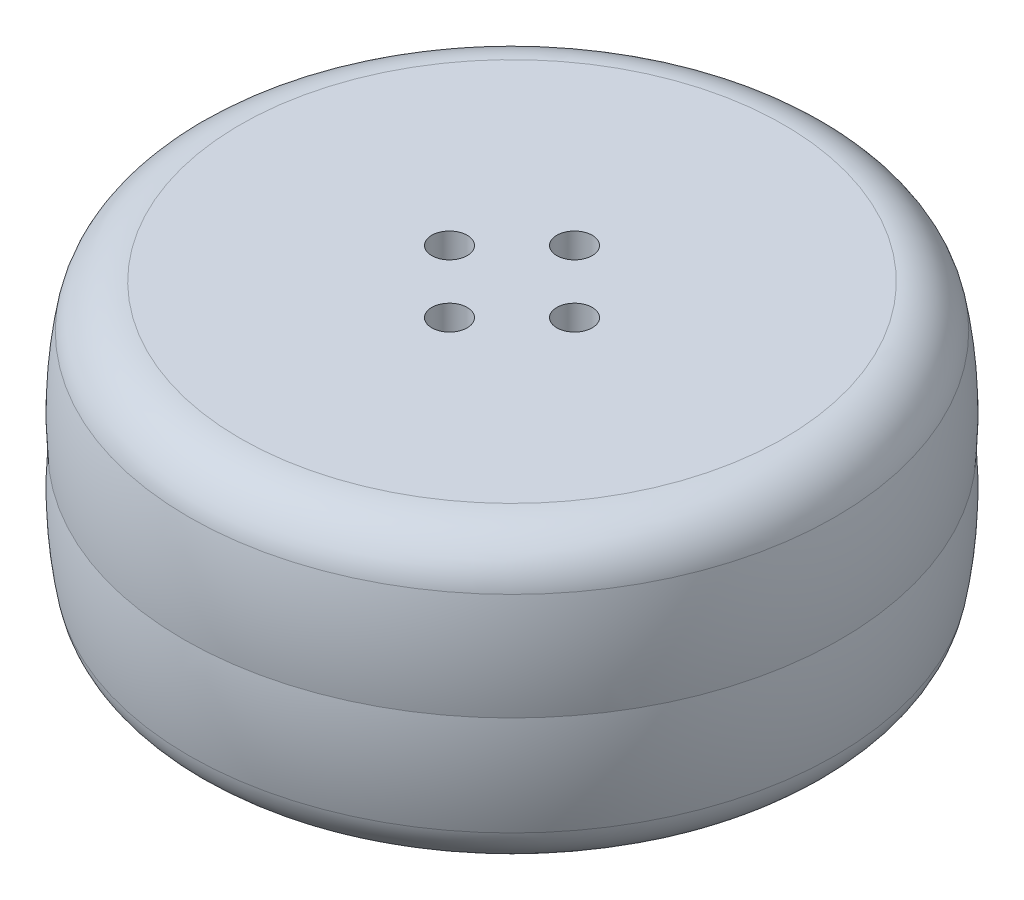
ISO-10303-21;
HEADER;
FILE_DESCRIPTION(('STEP AP214'),'2;1');
FILE_NAME('part.step','',(''),(''),'','','');
FILE_SCHEMA(('AUTOMOTIVE_DESIGN { 1 0 10303 214 1 1 1 1 }'));
ENDSEC;
DATA;
#1=APPLICATION_CONTEXT('core data for automotive mechanical design processes');
#2=APPLICATION_PROTOCOL_DEFINITION('international standard','automotive_design',2000,#1);
#3=PRODUCT_CONTEXT('',#1,'mechanical');
#4=PRODUCT('Part','Part','',(#3));
#5=PRODUCT_RELATED_PRODUCT_CATEGORY('part','',(#4));
#6=PRODUCT_DEFINITION_FORMATION('','',#4);
#7=PRODUCT_DEFINITION_CONTEXT('part definition',#1,'design');
#8=PRODUCT_DEFINITION('design','',#6,#7);
#9=PRODUCT_DEFINITION_SHAPE('','',#8);
#10=(LENGTH_UNIT() NAMED_UNIT(*) SI_UNIT(.MILLI.,.METRE.));
#11=(NAMED_UNIT(*) PLANE_ANGLE_UNIT() SI_UNIT($,.RADIAN.));
#12=(NAMED_UNIT(*) SI_UNIT($,.STERADIAN.) SOLID_ANGLE_UNIT());
#13=UNCERTAINTY_MEASURE_WITH_UNIT(LENGTH_MEASURE(1.E-05),#10,'distance_accuracy_value','');
#14=(GEOMETRIC_REPRESENTATION_CONTEXT(3) GLOBAL_UNCERTAINTY_ASSIGNED_CONTEXT((#13)) GLOBAL_UNIT_ASSIGNED_CONTEXT((#10,
#11,#12)) REPRESENTATION_CONTEXT('',''));
#15=CARTESIAN_POINT('',(0.,0.,0.));
#16=DIRECTION('',(0.,0.,1.));
#17=DIRECTION('',(1.,0.,0.));
#18=AXIS2_PLACEMENT_3D('',#15,#16,#17);
#19=CARTESIAN_POINT('',(0.,-17.9587381258583,0.));
#20=DIRECTION('',(0.,-1.,0.));
#21=DIRECTION('',(0.,0.,-1.));
#22=AXIS2_PLACEMENT_3D('',#19,#20,#21);
#23=PLANE('',#22);
#24=CARTESIAN_POINT('',(0.,-17.9587381258583,-6.));
#25=DIRECTION('',(0.,1.,0.));
#26=DIRECTION('',(0.,0.,1.));
#27=AXIS2_PLACEMENT_3D('',#24,#25,#26);
#28=CIRCLE('',#27,1.7);
#29=CARTESIAN_POINT('',(0.,-17.9587381258583,-4.3));
#30=VERTEX_POINT('',#29);
#31=EDGE_CURVE('E76',#30,#30,#28,.T.);
#32=ORIENTED_EDGE('',*,*,#31,.F.);
#33=EDGE_LOOP('',(#32));
#34=FACE_BOUND('',#33,.T.);
#35=CARTESIAN_POINT('',(6.,-17.9587381258583,0.));
#36=DIRECTION('',(0.,1.,0.));
#37=DIRECTION('',(0.,0.,1.));
#38=AXIS2_PLACEMENT_3D('',#35,#36,#37);
#39=CIRCLE('',#38,1.7);
#40=CARTESIAN_POINT('',(6.,-17.9587381258583,1.70000000000004));
#41=VERTEX_POINT('',#40);
#42=EDGE_CURVE('E80',#41,#41,#39,.T.);
#43=ORIENTED_EDGE('',*,*,#42,.F.);
#44=EDGE_LOOP('',(#43));
#45=FACE_BOUND('',#44,.T.);
#46=CARTESIAN_POINT('',(0.,-17.9587381258583,6.));
#47=DIRECTION('',(0.,1.,0.));
#48=DIRECTION('',(0.,0.,1.));
#49=AXIS2_PLACEMENT_3D('',#46,#47,#48);
#50=CIRCLE('',#49,1.7);
#51=CARTESIAN_POINT('',(0.,-17.9587381258583,7.7));
#52=VERTEX_POINT('',#51);
#53=EDGE_CURVE('E84',#52,#52,#50,.T.);
#54=ORIENTED_EDGE('',*,*,#53,.F.);
#55=EDGE_LOOP('',(#54));
#56=FACE_BOUND('',#55,.T.);
#57=CARTESIAN_POINT('',(-6.,-17.9587381258583,0.));
#58=DIRECTION('',(0.,1.,0.));
#59=DIRECTION('',(0.,0.,1.));
#60=AXIS2_PLACEMENT_3D('',#57,#58,#59);
#61=CIRCLE('',#60,1.7);
#62=CARTESIAN_POINT('',(-6.,-17.9587381258583,1.7));
#63=VERTEX_POINT('',#62);
#64=EDGE_CURVE('E87',#63,#63,#61,.T.);
#65=ORIENTED_EDGE('',*,*,#64,.F.);
#66=EDGE_LOOP('',(#65));
#67=FACE_BOUND('',#66,.T.);
#68=CARTESIAN_POINT('',(0.,-17.9587381258583,0.));
#69=DIRECTION('',(0.,1.,0.));
#70=DIRECTION('',(0.,0.,1.));
#71=AXIS2_PLACEMENT_3D('',#68,#69,#70);
#72=CIRCLE('',#71,26.0781368785709);
#73=CARTESIAN_POINT('',(0.,-17.9587381258583,26.0781368785709));
#74=VERTEX_POINT('',#73);
#75=EDGE_CURVE('E10',#74,#74,#72,.T.);
#76=ORIENTED_EDGE('',*,*,#75,.T.);
#77=EDGE_LOOP('',(#76));
#78=FACE_BOUND('',#77,.T.);
#79=ADVANCED_FACE('F31',(#34,#45,#56,#67,#78),#23,.F.);
#80=CARTESIAN_POINT('',(0.,-22.9587381258583,0.));
#81=DIRECTION('',(0.,1.,0.));
#82=DIRECTION('',(0.,0.,1.));
#83=AXIS2_PLACEMENT_3D('',#80,#81,#82);
#84=TOROIDAL_SURFACE('',#83,26.0781368785709,5.);
#85=ORIENTED_EDGE('',*,*,#75,.F.);
#86=EDGE_LOOP('',(#85));
#87=FACE_BOUND('',#86,.T.);
#88=CARTESIAN_POINT('',(0.,-22.0459118257492,0.));
#89=DIRECTION('',(0.,1.,0.));
#90=DIRECTION('',(0.,0.,1.));
#91=AXIS2_PLACEMENT_3D('',#88,#89,#90);
#92=CIRCLE('',#91,30.9941055670217);
#93=CARTESIAN_POINT('',(0.,-22.0459118257492,30.9941055670217));
#94=VERTEX_POINT('',#93);
#95=EDGE_CURVE('E37',#94,#94,#92,.T.);
#96=ORIENTED_EDGE('',*,*,#95,.T.);
#97=EDGE_LOOP('',(#96));
#98=FACE_BOUND('',#97,.T.);
#99=ADVANCED_FACE('F60',(#87,#98),#84,.T.);
#100=CARTESIAN_POINT('',(0.,-31.9587381258583,-31.5));
#101=CARTESIAN_POINT('',(0.,-28.6447966830478,-31.7712144320331));
#102=CARTESIAN_POINT('',(0.,-25.308943196372,-31.6000046363512));
#103=CARTESIAN_POINT('',(0.,-22.0459118257492,-30.9941055670217));
#104=B_SPLINE_CURVE_WITH_KNOTS('',3,(#100,#101,#102,#103),.UNSPECIFIED.,.F.,.F.,(4,4),
(0.295650736375984,1.),.UNSPECIFIED.);
#105=CARTESIAN_POINT('',(0.,-17.9587381258583,0.));
#106=DIRECTION('',(0.,1.,0.));
#107=AXIS1_PLACEMENT('',#105,#106);
#108=SURFACE_OF_REVOLUTION('',#104,#107);
#109=ORIENTED_EDGE('',*,*,#95,.F.);
#110=EDGE_LOOP('',(#109));
#111=FACE_BOUND('',#110,.T.);
#112=CARTESIAN_POINT('',(0.,-31.9587381258583,0.));
#113=DIRECTION('',(0.,1.,0.));
#114=DIRECTION('',(0.,0.,1.));
#115=AXIS2_PLACEMENT_3D('',#112,#113,#114);
#116=CIRCLE('',#115,31.5);
#117=CARTESIAN_POINT('',(0.,-31.9587381258583,31.5));
#118=VERTEX_POINT('',#117);
#119=EDGE_CURVE('E93',#118,#118,#116,.T.);
#120=ORIENTED_EDGE('',*,*,#119,.T.);
#121=EDGE_LOOP('',(#120));
#122=FACE_BOUND('',#121,.T.);
#123=ADVANCED_FACE('F56',(#111,#122),#108,.T.);
#124=CARTESIAN_POINT('',(0.,-45.9587381258583,0.));
#125=DIRECTION('',(0.,1.,0.));
#126=DIRECTION('',(0.,0.,-1.));
#127=AXIS2_PLACEMENT_3D('',#124,#125,#126);
#128=PLANE('',#127);
#129=CARTESIAN_POINT('',(0.,-45.9587381258583,19.5696524139372));
#130=DIRECTION('',(0.,-1.,0.));
#131=DIRECTION('',(0.,0.,-1.));
#132=AXIS2_PLACEMENT_3D('',#129,#130,#131);
#133=CIRCLE('',#132,1.75144093516283);
#134=CARTESIAN_POINT('',(0.,-45.9587381258583,17.8182114787744));
#135=VERTEX_POINT('',#134);
#136=EDGE_CURVE('E136',#135,#135,#133,.T.);
#137=ORIENTED_EDGE('',*,*,#136,.F.);
#138=EDGE_LOOP('',(#137));
#139=FACE_BOUND('',#138,.T.);
#140=CARTESIAN_POINT('',(21.59,-45.9587381258583,-2.78234758606276));
#141=DIRECTION('',(0.,-1.,0.));
#142=DIRECTION('',(0.,0.,-1.));
#143=AXIS2_PLACEMENT_3D('',#140,#141,#142);
#144=CIRCLE('',#143,1.75144093516283);
#145=CARTESIAN_POINT('',(21.59,-45.9587381258583,-4.53378852122559));
#146=VERTEX_POINT('',#145);
#147=EDGE_CURVE('E140',#146,#146,#144,.T.);
#148=ORIENTED_EDGE('',*,*,#147,.F.);
#149=EDGE_LOOP('',(#148));
#150=FACE_BOUND('',#149,.T.);
#151=CARTESIAN_POINT('',(-21.59,-45.9587381258583,-2.78234758606277));
#152=DIRECTION('',(0.,-1.,0.));
#153=DIRECTION('',(0.,0.,-1.));
#154=AXIS2_PLACEMENT_3D('',#151,#152,#153);
#155=CIRCLE('',#154,1.75144093516283);
#156=CARTESIAN_POINT('',(-21.59,-45.9587381258583,-4.5337885212256));
#157=VERTEX_POINT('',#156);
#158=EDGE_CURVE('E143',#157,#157,#155,.T.);
#159=ORIENTED_EDGE('',*,*,#158,.F.);
#160=EDGE_LOOP('',(#159));
#161=FACE_BOUND('',#160,.T.);
#162=CARTESIAN_POINT('',(0.,-45.9587381258583,0.));
#163=DIRECTION('',(0.,1.,0.));
#164=DIRECTION('',(0.,0.,1.));
#165=AXIS2_PLACEMENT_3D('',#162,#163,#164);
#166=CIRCLE('',#165,26.0781368785709);
#167=CARTESIAN_POINT('',(0.,-45.9587381258583,26.0781368785709));
#168=VERTEX_POINT('',#167);
#169=EDGE_CURVE('E41',#168,#168,#166,.T.);
#170=ORIENTED_EDGE('',*,*,#169,.F.);
#171=EDGE_LOOP('',(#170));
#172=FACE_BOUND('',#171,.T.);
#173=ADVANCED_FACE('F59',(#139,#150,#161,#172),#128,.F.);
#174=CARTESIAN_POINT('',(0.,-40.9587381258582,0.));
#175=DIRECTION('',(0.,-1.,0.));
#176=DIRECTION('',(0.,0.,1.));
#177=AXIS2_PLACEMENT_3D('',#174,#175,#176);
#178=TOROIDAL_SURFACE('',#177,26.0781368785709,5.);
#179=ORIENTED_EDGE('',*,*,#169,.T.);
#180=EDGE_LOOP('',(#179));
#181=FACE_BOUND('',#180,.T.);
#182=CARTESIAN_POINT('',(0.,-41.8715644259673,0.));
#183=DIRECTION('',(0.,1.,0.));
#184=DIRECTION('',(0.,0.,1.));
#185=AXIS2_PLACEMENT_3D('',#182,#183,#184);
#186=CIRCLE('',#185,30.9941055670217);
#187=CARTESIAN_POINT('',(0.,-41.8715644259673,30.9941055670217));
#188=VERTEX_POINT('',#187);
#189=EDGE_CURVE('E45',#188,#188,#186,.T.);
#190=ORIENTED_EDGE('',*,*,#189,.F.);
#191=EDGE_LOOP('',(#190));
#192=FACE_BOUND('',#191,.T.);
#193=ADVANCED_FACE('F111',(#181,#192),#178,.T.);
#194=CARTESIAN_POINT('',(0.,-31.9587381258583,-31.5));
#195=CARTESIAN_POINT('',(0.,-35.2726795686687,-31.7712144320331));
#196=CARTESIAN_POINT('',(0.,-38.6085330553446,-31.6000046363512));
#197=CARTESIAN_POINT('',(0.,-41.8715644259673,-30.9941055670217));
#198=B_SPLINE_CURVE_WITH_KNOTS('',3,(#194,#195,#196,#197),.UNSPECIFIED.,.F.,.F.,(4,4),
(0.295650736375984,1.),.UNSPECIFIED.);
#199=CARTESIAN_POINT('',(0.,-45.9587381258583,0.));
#200=DIRECTION('',(0.,-1.,0.));
#201=AXIS1_PLACEMENT('',#199,#200);
#202=SURFACE_OF_REVOLUTION('',#198,#201);
#203=ORIENTED_EDGE('',*,*,#189,.T.);
#204=EDGE_LOOP('',(#203));
#205=FACE_BOUND('',#204,.T.);
#206=ORIENTED_EDGE('',*,*,#119,.F.);
#207=EDGE_LOOP('',(#206));
#208=FACE_BOUND('',#207,.T.);
#209=ADVANCED_FACE('F107',(#205,#208),#202,.T.);
#210=CARTESIAN_POINT('',(-6.,-27.9587381258583,0.));
#211=DIRECTION('',(0.,1.,0.));
#212=DIRECTION('',(0.,0.,1.));
#213=AXIS2_PLACEMENT_3D('',#210,#211,#212);
#214=CYLINDRICAL_SURFACE('',#213,1.7);
#215=CARTESIAN_POINT('',(-6.,-27.9587381258583,0.));
#216=DIRECTION('',(0.,1.,0.));
#217=DIRECTION('',(0.,0.,1.));
#218=AXIS2_PLACEMENT_3D('',#215,#216,#217);
#219=CIRCLE('',#218,1.7);
#220=CARTESIAN_POINT('',(-6.,-27.9587381258583,1.7));
#221=VERTEX_POINT('',#220);
#222=EDGE_CURVE('E89',#221,#221,#219,.T.);
#223=ORIENTED_EDGE('',*,*,#222,.F.);
#224=EDGE_LOOP('',(#223));
#225=FACE_BOUND('',#224,.T.);
#226=ORIENTED_EDGE('',*,*,#64,.T.);
#227=EDGE_LOOP('',(#226));
#228=FACE_BOUND('',#227,.T.);
#229=ADVANCED_FACE('F110',(#225,#228),#214,.F.);
#230=CARTESIAN_POINT('',(-6.,-27.9587381258583,0.));
#231=DIRECTION('',(0.,1.,0.));
#232=DIRECTION('',(0.,0.,1.));
#233=AXIS2_PLACEMENT_3D('',#230,#231,#232);
#234=PLANE('',#233);
#235=ORIENTED_EDGE('',*,*,#222,.T.);
#236=EDGE_LOOP('',(#235));
#237=FACE_BOUND('',#236,.T.);
#238=ADVANCED_FACE('F165',(#237),#234,.T.);
#239=CARTESIAN_POINT('',(0.,-27.9587381258583,6.));
#240=DIRECTION('',(0.,1.,0.));
#241=DIRECTION('',(0.,0.,1.));
#242=AXIS2_PLACEMENT_3D('',#239,#240,#241);
#243=CYLINDRICAL_SURFACE('',#242,1.7);
#244=CARTESIAN_POINT('',(0.,-27.9587381258583,6.));
#245=DIRECTION('',(0.,1.,0.));
#246=DIRECTION('',(0.,0.,1.));
#247=AXIS2_PLACEMENT_3D('',#244,#245,#246);
#248=CIRCLE('',#247,1.7);
#249=CARTESIAN_POINT('',(0.,-27.9587381258583,7.7));
#250=VERTEX_POINT('',#249);
#251=EDGE_CURVE('E159',#250,#250,#248,.T.);
#252=ORIENTED_EDGE('',*,*,#251,.F.);
#253=EDGE_LOOP('',(#252));
#254=FACE_BOUND('',#253,.T.);
#255=ORIENTED_EDGE('',*,*,#53,.T.);
#256=EDGE_LOOP('',(#255));
#257=FACE_BOUND('',#256,.T.);
#258=ADVANCED_FACE('F162',(#254,#257),#243,.F.);
#259=CARTESIAN_POINT('',(0.,-27.9587381258583,6.));
#260=DIRECTION('',(0.,1.,0.));
#261=DIRECTION('',(0.,0.,1.));
#262=AXIS2_PLACEMENT_3D('',#259,#260,#261);
#263=PLANE('',#262);
#264=ORIENTED_EDGE('',*,*,#251,.T.);
#265=EDGE_LOOP('',(#264));
#266=FACE_BOUND('',#265,.T.);
#267=ADVANCED_FACE('F164',(#266),#263,.T.);
#268=CARTESIAN_POINT('',(6.,-27.9587381258583,0.));
#269=DIRECTION('',(0.,1.,0.));
#270=DIRECTION('',(0.,0.,1.));
#271=AXIS2_PLACEMENT_3D('',#268,#269,#270);
#272=CYLINDRICAL_SURFACE('',#271,1.7);
#273=CARTESIAN_POINT('',(6.,-27.9587381258583,0.));
#274=DIRECTION('',(0.,1.,0.));
#275=DIRECTION('',(0.,0.,1.));
#276=AXIS2_PLACEMENT_3D('',#273,#274,#275);
#277=CIRCLE('',#276,1.7);
#278=CARTESIAN_POINT('',(6.,-27.9587381258583,1.70000000000004));
#279=VERTEX_POINT('',#278);
#280=EDGE_CURVE('E155',#279,#279,#277,.T.);
#281=ORIENTED_EDGE('',*,*,#280,.F.);
#282=EDGE_LOOP('',(#281));
#283=FACE_BOUND('',#282,.T.);
#284=ORIENTED_EDGE('',*,*,#42,.T.);
#285=EDGE_LOOP('',(#284));
#286=FACE_BOUND('',#285,.T.);
#287=ADVANCED_FACE('F172',(#283,#286),#272,.F.);
#288=CARTESIAN_POINT('',(6.,-27.9587381258583,0.));
#289=DIRECTION('',(0.,1.,0.));
#290=DIRECTION('',(0.,0.,1.));
#291=AXIS2_PLACEMENT_3D('',#288,#289,#290);
#292=PLANE('',#291);
#293=ORIENTED_EDGE('',*,*,#280,.T.);
#294=EDGE_LOOP('',(#293));
#295=FACE_BOUND('',#294,.T.);
#296=ADVANCED_FACE('F180',(#295),#292,.T.);
#297=CARTESIAN_POINT('',(0.,-27.9587381258583,-6.));
#298=DIRECTION('',(0.,1.,0.));
#299=DIRECTION('',(0.,0.,1.));
#300=AXIS2_PLACEMENT_3D('',#297,#298,#299);
#301=CYLINDRICAL_SURFACE('',#300,1.7);
#302=CARTESIAN_POINT('',(0.,-27.9587381258583,-6.));
#303=DIRECTION('',(0.,1.,0.));
#304=DIRECTION('',(0.,0.,1.));
#305=AXIS2_PLACEMENT_3D('',#302,#303,#304);
#306=CIRCLE('',#305,1.7);
#307=CARTESIAN_POINT('',(0.,-27.9587381258583,-4.3));
#308=VERTEX_POINT('',#307);
#309=EDGE_CURVE('E90',#308,#308,#306,.T.);
#310=ORIENTED_EDGE('',*,*,#309,.F.);
#311=EDGE_LOOP('',(#310));
#312=FACE_BOUND('',#311,.T.);
#313=ORIENTED_EDGE('',*,*,#31,.T.);
#314=EDGE_LOOP('',(#313));
#315=FACE_BOUND('',#314,.T.);
#316=ADVANCED_FACE('F184',(#312,#315),#301,.F.);
#317=CARTESIAN_POINT('',(0.,-27.9587381258583,-6.));
#318=DIRECTION('',(0.,1.,0.));
#319=DIRECTION('',(0.,0.,1.));
#320=AXIS2_PLACEMENT_3D('',#317,#318,#319);
#321=PLANE('',#320);
#322=ORIENTED_EDGE('',*,*,#309,.T.);
#323=EDGE_LOOP('',(#322));
#324=FACE_BOUND('',#323,.T.);
#325=ADVANCED_FACE('F188',(#324),#321,.T.);
#326=CARTESIAN_POINT('',(-21.59,-35.9587381258583,-2.78234758606277));
#327=DIRECTION('',(0.,-1.,0.));
#328=DIRECTION('',(0.,0.,-1.));
#329=AXIS2_PLACEMENT_3D('',#326,#327,#328);
#330=CYLINDRICAL_SURFACE('',#329,1.75144093516283);
#331=CARTESIAN_POINT('',(-21.59,-35.9587381258583,-2.78234758606277));
#332=DIRECTION('',(0.,-1.,0.));
#333=DIRECTION('',(0.,0.,-1.));
#334=AXIS2_PLACEMENT_3D('',#331,#332,#333);
#335=CIRCLE('',#334,1.75144093516283);
#336=CARTESIAN_POINT('',(-21.59,-35.9587381258583,-4.5337885212256));
#337=VERTEX_POINT('',#336);
#338=EDGE_CURVE('E145',#337,#337,#335,.T.);
#339=ORIENTED_EDGE('',*,*,#338,.F.);
#340=EDGE_LOOP('',(#339));
#341=FACE_BOUND('',#340,.T.);
#342=ORIENTED_EDGE('',*,*,#158,.T.);
#343=EDGE_LOOP('',(#342));
#344=FACE_BOUND('',#343,.T.);
#345=ADVANCED_FACE('F192',(#341,#344),#330,.F.);
#346=CARTESIAN_POINT('',(-21.59,-35.9587381258583,-2.78234758606277));
#347=DIRECTION('',(0.,-1.,0.));
#348=DIRECTION('',(0.,0.,-1.));
#349=AXIS2_PLACEMENT_3D('',#346,#347,#348);
#350=PLANE('',#349);
#351=ORIENTED_EDGE('',*,*,#338,.T.);
#352=EDGE_LOOP('',(#351));
#353=FACE_BOUND('',#352,.T.);
#354=ADVANCED_FACE('F196',(#353),#350,.T.);
#355=CARTESIAN_POINT('',(21.59,-35.9587381258583,-2.78234758606276));
#356=DIRECTION('',(0.,-1.,0.));
#357=DIRECTION('',(0.,0.,-1.));
#358=AXIS2_PLACEMENT_3D('',#355,#356,#357);
#359=CYLINDRICAL_SURFACE('',#358,1.75144093516283);
#360=CARTESIAN_POINT('',(21.59,-35.9587381258583,-2.78234758606276));
#361=DIRECTION('',(0.,-1.,0.));
#362=DIRECTION('',(0.,0.,-1.));
#363=AXIS2_PLACEMENT_3D('',#360,#361,#362);
#364=CIRCLE('',#363,1.75144093516283);
#365=CARTESIAN_POINT('',(21.59,-35.9587381258583,-4.53378852122559));
#366=VERTEX_POINT('',#365);
#367=EDGE_CURVE('E220',#366,#366,#364,.T.);
#368=ORIENTED_EDGE('',*,*,#367,.F.);
#369=EDGE_LOOP('',(#368));
#370=FACE_BOUND('',#369,.T.);
#371=ORIENTED_EDGE('',*,*,#147,.T.);
#372=EDGE_LOOP('',(#371));
#373=FACE_BOUND('',#372,.T.);
#374=ADVANCED_FACE('F200',(#370,#373),#359,.F.);
#375=CARTESIAN_POINT('',(21.59,-35.9587381258583,-2.78234758606276));
#376=DIRECTION('',(0.,-1.,0.));
#377=DIRECTION('',(0.,0.,-1.));
#378=AXIS2_PLACEMENT_3D('',#375,#376,#377);
#379=PLANE('',#378);
#380=ORIENTED_EDGE('',*,*,#367,.T.);
#381=EDGE_LOOP('',(#380));
#382=FACE_BOUND('',#381,.T.);
#383=ADVANCED_FACE('F204',(#382),#379,.T.);
#384=CARTESIAN_POINT('',(0.,-35.9587381258583,19.5696524139372));
#385=DIRECTION('',(0.,-1.,0.));
#386=DIRECTION('',(0.,0.,-1.));
#387=AXIS2_PLACEMENT_3D('',#384,#385,#386);
#388=CYLINDRICAL_SURFACE('',#387,1.75144093516283);
#389=CARTESIAN_POINT('',(0.,-35.9587381258583,19.5696524139372));
#390=DIRECTION('',(0.,-1.,0.));
#391=DIRECTION('',(0.,0.,-1.));
#392=AXIS2_PLACEMENT_3D('',#389,#390,#391);
#393=CIRCLE('',#392,1.75144093516283);
#394=CARTESIAN_POINT('',(0.,-35.9587381258583,17.8182114787744));
#395=VERTEX_POINT('',#394);
#396=EDGE_CURVE('E146',#395,#395,#393,.T.);
#397=ORIENTED_EDGE('',*,*,#396,.F.);
#398=EDGE_LOOP('',(#397));
#399=FACE_BOUND('',#398,.T.);
#400=ORIENTED_EDGE('',*,*,#136,.T.);
#401=EDGE_LOOP('',(#400));
#402=FACE_BOUND('',#401,.T.);
#403=ADVANCED_FACE('F208',(#399,#402),#388,.F.);
#404=CARTESIAN_POINT('',(0.,-35.9587381258583,19.5696524139372));
#405=DIRECTION('',(0.,-1.,0.));
#406=DIRECTION('',(0.,0.,-1.));
#407=AXIS2_PLACEMENT_3D('',#404,#405,#406);
#408=PLANE('',#407);
#409=ORIENTED_EDGE('',*,*,#396,.T.);
#410=EDGE_LOOP('',(#409));
#411=FACE_BOUND('',#410,.T.);
#412=ADVANCED_FACE('F212',(#411),#408,.T.);
#413=CLOSED_SHELL('',(#79,#99,#123,#173,#193,#209,#229,#238,#258,#267,#287,#296,#316,#325,#345,
#354,#374,#383,#403,#412));
#414=MANIFOLD_SOLID_BREP('B2',#413);
#415=ADVANCED_BREP_SHAPE_REPRESENTATION('',(#18,#414),#14);
#416=SHAPE_DEFINITION_REPRESENTATION(#9,#415);
ENDSEC;
END-ISO-10303-21;
